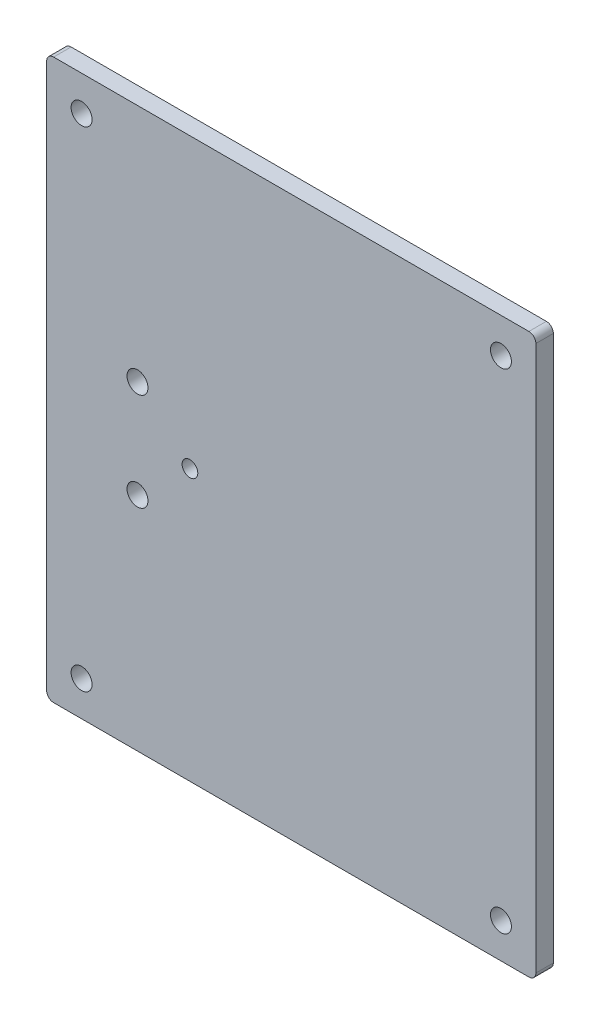
ISO-10303-21;
HEADER;
FILE_DESCRIPTION(('STEP AP214'),'2;1');
FILE_NAME('part.step','',(''),(''),'','','');
FILE_SCHEMA(('AUTOMOTIVE_DESIGN { 1 0 10303 214 1 1 1 1 }'));
ENDSEC;
DATA;
#1=APPLICATION_CONTEXT('core data for automotive mechanical design processes');
#2=APPLICATION_PROTOCOL_DEFINITION('international standard','automotive_design',2000,#1);
#3=PRODUCT_CONTEXT('',#1,'mechanical');
#4=PRODUCT('Part','Part','',(#3));
#5=PRODUCT_RELATED_PRODUCT_CATEGORY('part','',(#4));
#6=PRODUCT_DEFINITION_FORMATION('','',#4);
#7=PRODUCT_DEFINITION_CONTEXT('part definition',#1,'design');
#8=PRODUCT_DEFINITION('design','',#6,#7);
#9=PRODUCT_DEFINITION_SHAPE('','',#8);
#10=(LENGTH_UNIT() NAMED_UNIT(*) SI_UNIT(.MILLI.,.METRE.));
#11=(NAMED_UNIT(*) PLANE_ANGLE_UNIT() SI_UNIT($,.RADIAN.));
#12=(NAMED_UNIT(*) SI_UNIT($,.STERADIAN.) SOLID_ANGLE_UNIT());
#13=UNCERTAINTY_MEASURE_WITH_UNIT(LENGTH_MEASURE(1.E-05),#10,'distance_accuracy_value','');
#14=(GEOMETRIC_REPRESENTATION_CONTEXT(3) GLOBAL_UNCERTAINTY_ASSIGNED_CONTEXT((#13)) GLOBAL_UNIT_ASSIGNED_CONTEXT((#10,
#11,#12)) REPRESENTATION_CONTEXT('',''));
#15=CARTESIAN_POINT('',(0.,0.,0.));
#16=DIRECTION('',(0.,0.,1.));
#17=DIRECTION('',(1.,0.,0.));
#18=AXIS2_PLACEMENT_3D('',#15,#16,#17);
#19=CARTESIAN_POINT('',(0.,0.,5.));
#20=DIRECTION('',(0.,0.,-1.));
#21=DIRECTION('',(-1.,0.,0.));
#22=AXIS2_PLACEMENT_3D('',#19,#20,#21);
#23=PLANE('',#22);
#24=DIRECTION('',(0.,-1.,0.));
#25=VECTOR('',#24,1.);
#26=CARTESIAN_POINT('',(0.,0.,5.));
#27=LINE('',#26,#25);
#28=CARTESIAN_POINT('',(0.,158.,5.));
#29=VERTEX_POINT('',#28);
#30=CARTESIAN_POINT('',(0.,2.,5.));
#31=VERTEX_POINT('',#30);
#32=EDGE_CURVE('E135',#29,#31,#27,.T.);
#33=ORIENTED_EDGE('',*,*,#32,.T.);
#34=CARTESIAN_POINT('',(2.,2.,5.));
#35=DIRECTION('',(0.,0.,-1.));
#36=DIRECTION('',(-1.,0.,0.));
#37=AXIS2_PLACEMENT_3D('',#34,#35,#36);
#38=CIRCLE('',#37,2.);
#39=CARTESIAN_POINT('',(2.,0.,5.));
#40=VERTEX_POINT('',#39);
#41=EDGE_CURVE('E154',#31,#40,#38,.F.);
#42=ORIENTED_EDGE('',*,*,#41,.T.);
#43=DIRECTION('',(1.,0.,0.));
#44=VECTOR('',#43,1.);
#45=CARTESIAN_POINT('',(140.,0.,5.));
#46=LINE('',#45,#44);
#47=CARTESIAN_POINT('',(138.,0.,5.));
#48=VERTEX_POINT('',#47);
#49=EDGE_CURVE('E118',#40,#48,#46,.T.);
#50=ORIENTED_EDGE('',*,*,#49,.T.);
#51=CARTESIAN_POINT('',(138.,2.,5.));
#52=DIRECTION('',(0.,0.,-1.));
#53=DIRECTION('',(-1.,0.,0.));
#54=AXIS2_PLACEMENT_3D('',#51,#52,#53);
#55=CIRCLE('',#54,2.);
#56=CARTESIAN_POINT('',(140.,2.,5.));
#57=VERTEX_POINT('',#56);
#58=EDGE_CURVE('E152',#48,#57,#55,.F.);
#59=ORIENTED_EDGE('',*,*,#58,.T.);
#60=DIRECTION('',(0.,1.,0.));
#61=VECTOR('',#60,1.);
#62=CARTESIAN_POINT('',(140.,160.,5.));
#63=LINE('',#62,#61);
#64=CARTESIAN_POINT('',(140.,158.,5.));
#65=VERTEX_POINT('',#64);
#66=EDGE_CURVE('E174',#57,#65,#63,.T.);
#67=ORIENTED_EDGE('',*,*,#66,.T.);
#68=CARTESIAN_POINT('',(138.,158.,5.));
#69=DIRECTION('',(0.,0.,-1.));
#70=DIRECTION('',(-1.,0.,0.));
#71=AXIS2_PLACEMENT_3D('',#68,#69,#70);
#72=CIRCLE('',#71,2.);
#73=CARTESIAN_POINT('',(138.,160.,5.));
#74=VERTEX_POINT('',#73);
#75=EDGE_CURVE('E53',#65,#74,#72,.F.);
#76=ORIENTED_EDGE('',*,*,#75,.T.);
#77=DIRECTION('',(-1.,0.,0.));
#78=VECTOR('',#77,1.);
#79=CARTESIAN_POINT('',(0.,160.,5.));
#80=LINE('',#79,#78);
#81=CARTESIAN_POINT('',(2.,160.,5.));
#82=VERTEX_POINT('',#81);
#83=EDGE_CURVE('E164',#74,#82,#80,.T.);
#84=ORIENTED_EDGE('',*,*,#83,.T.);
#85=CARTESIAN_POINT('',(2.,158.,5.));
#86=DIRECTION('',(0.,0.,-1.));
#87=DIRECTION('',(-1.,0.,0.));
#88=AXIS2_PLACEMENT_3D('',#85,#86,#87);
#89=CIRCLE('',#88,2.);
#90=EDGE_CURVE('E150',#82,#29,#89,.F.);
#91=ORIENTED_EDGE('',*,*,#90,.T.);
#92=EDGE_LOOP('',(#33,#42,#50,#59,#67,#76,#84,#91));
#93=FACE_BOUND('',#92,.T.);
#94=CARTESIAN_POINT('',(26.,91.5,5.));
#95=DIRECTION('',(0.,0.,1.));
#96=DIRECTION('',(1.,0.,0.));
#97=AXIS2_PLACEMENT_3D('',#94,#95,#96);
#98=CIRCLE('',#97,3.);
#99=CARTESIAN_POINT('',(29.,91.5,5.));
#100=VERTEX_POINT('',#99);
#101=EDGE_CURVE('E126',#100,#100,#98,.T.);
#102=ORIENTED_EDGE('',*,*,#101,.F.);
#103=EDGE_LOOP('',(#102));
#104=FACE_BOUND('',#103,.T.);
#105=CARTESIAN_POINT('',(10.,150.,5.));
#106=DIRECTION('',(0.,0.,1.));
#107=DIRECTION('',(1.,0.,0.));
#108=AXIS2_PLACEMENT_3D('',#105,#106,#107);
#109=CIRCLE('',#108,3.);
#110=CARTESIAN_POINT('',(13.,150.,5.));
#111=VERTEX_POINT('',#110);
#112=EDGE_CURVE('E179',#111,#111,#109,.T.);
#113=ORIENTED_EDGE('',*,*,#112,.F.);
#114=EDGE_LOOP('',(#113));
#115=FACE_BOUND('',#114,.T.);
#116=CARTESIAN_POINT('',(130.,10.,5.));
#117=DIRECTION('',(0.,0.,1.));
#118=DIRECTION('',(1.,0.,0.));
#119=AXIS2_PLACEMENT_3D('',#116,#117,#118);
#120=CIRCLE('',#119,2.99999999999999);
#121=CARTESIAN_POINT('',(133.,10.,5.));
#122=VERTEX_POINT('',#121);
#123=EDGE_CURVE('E184',#122,#122,#120,.T.);
#124=ORIENTED_EDGE('',*,*,#123,.F.);
#125=EDGE_LOOP('',(#124));
#126=FACE_BOUND('',#125,.T.);
#127=CARTESIAN_POINT('',(10.,10.,5.));
#128=DIRECTION('',(0.,0.,1.));
#129=DIRECTION('',(1.,0.,0.));
#130=AXIS2_PLACEMENT_3D('',#127,#128,#129);
#131=CIRCLE('',#130,3.);
#132=CARTESIAN_POINT('',(13.,10.,5.));
#133=VERTEX_POINT('',#132);
#134=EDGE_CURVE('E190',#133,#133,#131,.T.);
#135=ORIENTED_EDGE('',*,*,#134,.F.);
#136=EDGE_LOOP('',(#135));
#137=FACE_BOUND('',#136,.T.);
#138=CARTESIAN_POINT('',(130.,150.,5.));
#139=DIRECTION('',(0.,0.,1.));
#140=DIRECTION('',(1.,0.,0.));
#141=AXIS2_PLACEMENT_3D('',#138,#139,#140);
#142=CIRCLE('',#141,2.99999999999999);
#143=CARTESIAN_POINT('',(133.,150.,5.));
#144=VERTEX_POINT('',#143);
#145=EDGE_CURVE('E196',#144,#144,#142,.T.);
#146=ORIENTED_EDGE('',*,*,#145,.F.);
#147=EDGE_LOOP('',(#146));
#148=FACE_BOUND('',#147,.T.);
#149=CARTESIAN_POINT('',(26.,63.5,5.));
#150=DIRECTION('',(0.,0.,1.));
#151=DIRECTION('',(1.,0.,0.));
#152=AXIS2_PLACEMENT_3D('',#149,#150,#151);
#153=CIRCLE('',#152,3.);
#154=CARTESIAN_POINT('',(29.,63.5,5.));
#155=VERTEX_POINT('',#154);
#156=EDGE_CURVE('E202',#155,#155,#153,.T.);
#157=ORIENTED_EDGE('',*,*,#156,.F.);
#158=EDGE_LOOP('',(#157));
#159=FACE_BOUND('',#158,.T.);
#160=CARTESIAN_POINT('',(41.,77.5,5.));
#161=DIRECTION('',(0.,0.,1.));
#162=DIRECTION('',(1.,0.,0.));
#163=AXIS2_PLACEMENT_3D('',#160,#161,#162);
#164=CIRCLE('',#163,2.24999999999999);
#165=CARTESIAN_POINT('',(43.25,77.5,5.));
#166=VERTEX_POINT('',#165);
#167=EDGE_CURVE('E208',#166,#166,#164,.T.);
#168=ORIENTED_EDGE('',*,*,#167,.F.);
#169=EDGE_LOOP('',(#168));
#170=FACE_BOUND('',#169,.T.);
#171=ADVANCED_FACE('F33',(#93,#104,#115,#126,#137,#148,#159,#170),#23,.F.);
#172=CARTESIAN_POINT('',(0.,0.,0.));
#173=DIRECTION('',(0.,0.,-1.));
#174=DIRECTION('',(-1.,0.,0.));
#175=AXIS2_PLACEMENT_3D('',#172,#173,#174);
#176=PLANE('',#175);
#177=CARTESIAN_POINT('',(26.,63.5,0.));
#178=DIRECTION('',(0.,0.,1.));
#179=DIRECTION('',(1.,0.,0.));
#180=AXIS2_PLACEMENT_3D('',#177,#178,#179);
#181=CIRCLE('',#180,3.);
#182=CARTESIAN_POINT('',(29.,63.5,0.));
#183=VERTEX_POINT('',#182);
#184=EDGE_CURVE('E205',#183,#183,#181,.T.);
#185=ORIENTED_EDGE('',*,*,#184,.T.);
#186=EDGE_LOOP('',(#185));
#187=FACE_BOUND('',#186,.T.);
#188=CARTESIAN_POINT('',(10.,10.,0.));
#189=DIRECTION('',(0.,0.,1.));
#190=DIRECTION('',(1.,0.,0.));
#191=AXIS2_PLACEMENT_3D('',#188,#189,#190);
#192=CIRCLE('',#191,3.);
#193=CARTESIAN_POINT('',(13.,10.,0.));
#194=VERTEX_POINT('',#193);
#195=EDGE_CURVE('E193',#194,#194,#192,.T.);
#196=ORIENTED_EDGE('',*,*,#195,.T.);
#197=EDGE_LOOP('',(#196));
#198=FACE_BOUND('',#197,.T.);
#199=CARTESIAN_POINT('',(10.,150.,0.));
#200=DIRECTION('',(0.,0.,1.));
#201=DIRECTION('',(1.,0.,0.));
#202=AXIS2_PLACEMENT_3D('',#199,#200,#201);
#203=CIRCLE('',#202,3.);
#204=CARTESIAN_POINT('',(13.,150.,0.));
#205=VERTEX_POINT('',#204);
#206=EDGE_CURVE('E181',#205,#205,#203,.T.);
#207=ORIENTED_EDGE('',*,*,#206,.T.);
#208=EDGE_LOOP('',(#207));
#209=FACE_BOUND('',#208,.T.);
#210=DIRECTION('',(1.,0.,0.));
#211=VECTOR('',#210,1.);
#212=CARTESIAN_POINT('',(140.,0.,0.));
#213=LINE('',#212,#211);
#214=CARTESIAN_POINT('',(2.,0.,0.));
#215=VERTEX_POINT('',#214);
#216=CARTESIAN_POINT('',(138.,0.,0.));
#217=VERTEX_POINT('',#216);
#218=EDGE_CURVE('E115',#215,#217,#213,.T.);
#219=ORIENTED_EDGE('',*,*,#218,.F.);
#220=CARTESIAN_POINT('',(2.,2.,0.));
#221=DIRECTION('',(0.,0.,-1.));
#222=DIRECTION('',(-1.,0.,0.));
#223=AXIS2_PLACEMENT_3D('',#220,#221,#222);
#224=CIRCLE('',#223,2.);
#225=CARTESIAN_POINT('',(0.,2.,0.));
#226=VERTEX_POINT('',#225);
#227=EDGE_CURVE('E98',#215,#226,#224,.T.);
#228=ORIENTED_EDGE('',*,*,#227,.T.);
#229=DIRECTION('',(0.,-1.,0.));
#230=VECTOR('',#229,1.);
#231=CARTESIAN_POINT('',(0.,0.,0.));
#232=LINE('',#231,#230);
#233=CARTESIAN_POINT('',(0.,158.,0.));
#234=VERTEX_POINT('',#233);
#235=EDGE_CURVE('E139',#234,#226,#232,.T.);
#236=ORIENTED_EDGE('',*,*,#235,.F.);
#237=CARTESIAN_POINT('',(2.,158.,0.));
#238=DIRECTION('',(0.,0.,-1.));
#239=DIRECTION('',(-1.,0.,0.));
#240=AXIS2_PLACEMENT_3D('',#237,#238,#239);
#241=CIRCLE('',#240,2.);
#242=CARTESIAN_POINT('',(2.,160.,0.));
#243=VERTEX_POINT('',#242);
#244=EDGE_CURVE('E143',#234,#243,#241,.T.);
#245=ORIENTED_EDGE('',*,*,#244,.T.);
#246=DIRECTION('',(-1.,0.,0.));
#247=VECTOR('',#246,1.);
#248=CARTESIAN_POINT('',(0.,160.,0.));
#249=LINE('',#248,#247);
#250=CARTESIAN_POINT('',(138.,160.,0.));
#251=VERTEX_POINT('',#250);
#252=EDGE_CURVE('E129',#251,#243,#249,.T.);
#253=ORIENTED_EDGE('',*,*,#252,.F.);
#254=CARTESIAN_POINT('',(138.,158.,0.));
#255=DIRECTION('',(0.,0.,-1.));
#256=DIRECTION('',(-1.,0.,0.));
#257=AXIS2_PLACEMENT_3D('',#254,#255,#256);
#258=CIRCLE('',#257,2.);
#259=CARTESIAN_POINT('',(140.,158.,0.));
#260=VERTEX_POINT('',#259);
#261=EDGE_CURVE('E119',#251,#260,#258,.T.);
#262=ORIENTED_EDGE('',*,*,#261,.T.);
#263=DIRECTION('',(0.,1.,0.));
#264=VECTOR('',#263,1.);
#265=CARTESIAN_POINT('',(140.,160.,0.));
#266=LINE('',#265,#264);
#267=CARTESIAN_POINT('',(140.,2.,0.));
#268=VERTEX_POINT('',#267);
#269=EDGE_CURVE('E125',#268,#260,#266,.T.);
#270=ORIENTED_EDGE('',*,*,#269,.F.);
#271=CARTESIAN_POINT('',(138.,2.,0.));
#272=DIRECTION('',(0.,0.,-1.));
#273=DIRECTION('',(-1.,0.,0.));
#274=AXIS2_PLACEMENT_3D('',#271,#272,#273);
#275=CIRCLE('',#274,2.);
#276=EDGE_CURVE('E109',#268,#217,#275,.T.);
#277=ORIENTED_EDGE('',*,*,#276,.T.);
#278=EDGE_LOOP('',(#219,#228,#236,#245,#253,#262,#270,#277));
#279=FACE_BOUND('',#278,.T.);
#280=CARTESIAN_POINT('',(26.,91.5,0.));
#281=DIRECTION('',(0.,0.,1.));
#282=DIRECTION('',(1.,0.,0.));
#283=AXIS2_PLACEMENT_3D('',#280,#281,#282);
#284=CIRCLE('',#283,3.);
#285=CARTESIAN_POINT('',(29.,91.5,0.));
#286=VERTEX_POINT('',#285);
#287=EDGE_CURVE('E132',#286,#286,#284,.T.);
#288=ORIENTED_EDGE('',*,*,#287,.T.);
#289=EDGE_LOOP('',(#288));
#290=FACE_BOUND('',#289,.T.);
#291=CARTESIAN_POINT('',(130.,10.,0.));
#292=DIRECTION('',(0.,0.,1.));
#293=DIRECTION('',(1.,0.,0.));
#294=AXIS2_PLACEMENT_3D('',#291,#292,#293);
#295=CIRCLE('',#294,2.99999999999999);
#296=CARTESIAN_POINT('',(133.,10.,0.));
#297=VERTEX_POINT('',#296);
#298=EDGE_CURVE('E187',#297,#297,#295,.T.);
#299=ORIENTED_EDGE('',*,*,#298,.T.);
#300=EDGE_LOOP('',(#299));
#301=FACE_BOUND('',#300,.T.);
#302=CARTESIAN_POINT('',(130.,150.,0.));
#303=DIRECTION('',(0.,0.,1.));
#304=DIRECTION('',(1.,0.,0.));
#305=AXIS2_PLACEMENT_3D('',#302,#303,#304);
#306=CIRCLE('',#305,2.99999999999999);
#307=CARTESIAN_POINT('',(133.,150.,0.));
#308=VERTEX_POINT('',#307);
#309=EDGE_CURVE('E199',#308,#308,#306,.T.);
#310=ORIENTED_EDGE('',*,*,#309,.T.);
#311=EDGE_LOOP('',(#310));
#312=FACE_BOUND('',#311,.T.);
#313=CARTESIAN_POINT('',(41.,77.5,0.));
#314=DIRECTION('',(0.,0.,1.));
#315=DIRECTION('',(1.,0.,0.));
#316=AXIS2_PLACEMENT_3D('',#313,#314,#315);
#317=CIRCLE('',#316,2.24999999999999);
#318=CARTESIAN_POINT('',(43.25,77.5,0.));
#319=VERTEX_POINT('',#318);
#320=EDGE_CURVE('E211',#319,#319,#317,.T.);
#321=ORIENTED_EDGE('',*,*,#320,.T.);
#322=EDGE_LOOP('',(#321));
#323=FACE_BOUND('',#322,.T.);
#324=ADVANCED_FACE('F122',(#187,#198,#209,#279,#290,#301,#312,#323),#176,.T.);
#325=CARTESIAN_POINT('',(140.,0.,5.));
#326=DIRECTION('',(0.,1.,0.));
#327=DIRECTION('',(-1.,0.,0.));
#328=AXIS2_PLACEMENT_3D('',#325,#326,#327);
#329=PLANE('',#328);
#330=ORIENTED_EDGE('',*,*,#49,.F.);
#331=DIRECTION('',(0.,0.,-1.));
#332=VECTOR('',#331,1.);
#333=CARTESIAN_POINT('',(2.,0.,5.));
#334=LINE('',#333,#332);
#335=EDGE_CURVE('E102',#40,#215,#334,.T.);
#336=ORIENTED_EDGE('',*,*,#335,.T.);
#337=ORIENTED_EDGE('',*,*,#218,.T.);
#338=DIRECTION('',(0.,0.,-1.));
#339=VECTOR('',#338,1.);
#340=CARTESIAN_POINT('',(138.,0.,5.));
#341=LINE('',#340,#339);
#342=EDGE_CURVE('E120',#217,#48,#341,.F.);
#343=ORIENTED_EDGE('',*,*,#342,.T.);
#344=EDGE_LOOP('',(#330,#336,#337,#343));
#345=FACE_BOUND('',#344,.T.);
#346=ADVANCED_FACE('F114',(#345),#329,.F.);
#347=CARTESIAN_POINT('',(140.,160.,5.));
#348=DIRECTION('',(-1.,0.,0.));
#349=DIRECTION('',(0.,-1.,0.));
#350=AXIS2_PLACEMENT_3D('',#347,#348,#349);
#351=PLANE('',#350);
#352=ORIENTED_EDGE('',*,*,#66,.F.);
#353=DIRECTION('',(0.,0.,-1.));
#354=VECTOR('',#353,1.);
#355=CARTESIAN_POINT('',(140.,2.,5.));
#356=LINE('',#355,#354);
#357=EDGE_CURVE('E158',#57,#268,#356,.T.);
#358=ORIENTED_EDGE('',*,*,#357,.T.);
#359=ORIENTED_EDGE('',*,*,#269,.T.);
#360=DIRECTION('',(0.,0.,-1.));
#361=VECTOR('',#360,1.);
#362=CARTESIAN_POINT('',(140.,158.,5.));
#363=LINE('',#362,#361);
#364=EDGE_CURVE('E156',#260,#65,#363,.F.);
#365=ORIENTED_EDGE('',*,*,#364,.T.);
#366=EDGE_LOOP('',(#352,#358,#359,#365));
#367=FACE_BOUND('',#366,.T.);
#368=ADVANCED_FACE('F236',(#367),#351,.F.);
#369=CARTESIAN_POINT('',(0.,160.,5.));
#370=DIRECTION('',(0.,-1.,0.));
#371=DIRECTION('',(0.,0.,-1.));
#372=AXIS2_PLACEMENT_3D('',#369,#370,#371);
#373=PLANE('',#372);
#374=ORIENTED_EDGE('',*,*,#252,.T.);
#375=DIRECTION('',(0.,0.,-1.));
#376=VECTOR('',#375,1.);
#377=CARTESIAN_POINT('',(2.,160.,5.));
#378=LINE('',#377,#376);
#379=EDGE_CURVE('E11',#243,#82,#378,.F.);
#380=ORIENTED_EDGE('',*,*,#379,.T.);
#381=ORIENTED_EDGE('',*,*,#83,.F.);
#382=DIRECTION('',(0.,0.,-1.));
#383=VECTOR('',#382,1.);
#384=CARTESIAN_POINT('',(138.,160.,5.));
#385=LINE('',#384,#383);
#386=EDGE_CURVE('E41',#74,#251,#385,.T.);
#387=ORIENTED_EDGE('',*,*,#386,.T.);
#388=EDGE_LOOP('',(#374,#380,#381,#387));
#389=FACE_BOUND('',#388,.T.);
#390=ADVANCED_FACE('F163',(#389),#373,.F.);
#391=CARTESIAN_POINT('',(0.,0.,5.));
#392=DIRECTION('',(1.,0.,0.));
#393=DIRECTION('',(0.,0.,-1.));
#394=AXIS2_PLACEMENT_3D('',#391,#392,#393);
#395=PLANE('',#394);
#396=ORIENTED_EDGE('',*,*,#235,.T.);
#397=DIRECTION('',(0.,0.,-1.));
#398=VECTOR('',#397,1.);
#399=CARTESIAN_POINT('',(0.,2.,5.));
#400=LINE('',#399,#398);
#401=EDGE_CURVE('E103',#226,#31,#400,.F.);
#402=ORIENTED_EDGE('',*,*,#401,.T.);
#403=ORIENTED_EDGE('',*,*,#32,.F.);
#404=DIRECTION('',(0.,0.,-1.));
#405=VECTOR('',#404,1.);
#406=CARTESIAN_POINT('',(0.,158.,5.));
#407=LINE('',#406,#405);
#408=EDGE_CURVE('E108',#29,#234,#407,.T.);
#409=ORIENTED_EDGE('',*,*,#408,.T.);
#410=EDGE_LOOP('',(#396,#402,#403,#409));
#411=FACE_BOUND('',#410,.T.);
#412=ADVANCED_FACE('F172',(#411),#395,.F.);
#413=CARTESIAN_POINT('',(26.,91.5,5.));
#414=DIRECTION('',(0.,0.,-1.));
#415=DIRECTION('',(-1.,0.,0.));
#416=AXIS2_PLACEMENT_3D('',#413,#414,#415);
#417=CYLINDRICAL_SURFACE('',#416,3.);
#418=ORIENTED_EDGE('',*,*,#101,.T.);
#419=EDGE_LOOP('',(#418));
#420=FACE_BOUND('',#419,.T.);
#421=ORIENTED_EDGE('',*,*,#287,.F.);
#422=EDGE_LOOP('',(#421));
#423=FACE_BOUND('',#422,.T.);
#424=ADVANCED_FACE('F229',(#420,#423),#417,.F.);
#425=CARTESIAN_POINT('',(10.,150.,5.));
#426=DIRECTION('',(0.,0.,-1.));
#427=DIRECTION('',(-1.,0.,0.));
#428=AXIS2_PLACEMENT_3D('',#425,#426,#427);
#429=CYLINDRICAL_SURFACE('',#428,3.);
#430=ORIENTED_EDGE('',*,*,#112,.T.);
#431=EDGE_LOOP('',(#430));
#432=FACE_BOUND('',#431,.T.);
#433=ORIENTED_EDGE('',*,*,#206,.F.);
#434=EDGE_LOOP('',(#433));
#435=FACE_BOUND('',#434,.T.);
#436=ADVANCED_FACE('F357',(#432,#435),#429,.F.);
#437=CARTESIAN_POINT('',(130.,10.,5.));
#438=DIRECTION('',(0.,0.,-1.));
#439=DIRECTION('',(-1.,0.,0.));
#440=AXIS2_PLACEMENT_3D('',#437,#438,#439);
#441=CYLINDRICAL_SURFACE('',#440,2.99999999999999);
#442=ORIENTED_EDGE('',*,*,#123,.T.);
#443=EDGE_LOOP('',(#442));
#444=FACE_BOUND('',#443,.T.);
#445=ORIENTED_EDGE('',*,*,#298,.F.);
#446=EDGE_LOOP('',(#445));
#447=FACE_BOUND('',#446,.T.);
#448=ADVANCED_FACE('F347',(#444,#447),#441,.F.);
#449=CARTESIAN_POINT('',(10.,10.,5.));
#450=DIRECTION('',(0.,0.,-1.));
#451=DIRECTION('',(-1.,0.,0.));
#452=AXIS2_PLACEMENT_3D('',#449,#450,#451);
#453=CYLINDRICAL_SURFACE('',#452,3.);
#454=ORIENTED_EDGE('',*,*,#134,.T.);
#455=EDGE_LOOP('',(#454));
#456=FACE_BOUND('',#455,.T.);
#457=ORIENTED_EDGE('',*,*,#195,.F.);
#458=EDGE_LOOP('',(#457));
#459=FACE_BOUND('',#458,.T.);
#460=ADVANCED_FACE('F337',(#456,#459),#453,.F.);
#461=CARTESIAN_POINT('',(130.,150.,5.));
#462=DIRECTION('',(0.,0.,-1.));
#463=DIRECTION('',(-1.,0.,0.));
#464=AXIS2_PLACEMENT_3D('',#461,#462,#463);
#465=CYLINDRICAL_SURFACE('',#464,2.99999999999999);
#466=ORIENTED_EDGE('',*,*,#145,.T.);
#467=EDGE_LOOP('',(#466));
#468=FACE_BOUND('',#467,.T.);
#469=ORIENTED_EDGE('',*,*,#309,.F.);
#470=EDGE_LOOP('',(#469));
#471=FACE_BOUND('',#470,.T.);
#472=ADVANCED_FACE('F327',(#468,#471),#465,.F.);
#473=CARTESIAN_POINT('',(26.,63.5,5.));
#474=DIRECTION('',(0.,0.,-1.));
#475=DIRECTION('',(-1.,0.,0.));
#476=AXIS2_PLACEMENT_3D('',#473,#474,#475);
#477=CYLINDRICAL_SURFACE('',#476,3.);
#478=ORIENTED_EDGE('',*,*,#156,.T.);
#479=EDGE_LOOP('',(#478));
#480=FACE_BOUND('',#479,.T.);
#481=ORIENTED_EDGE('',*,*,#184,.F.);
#482=EDGE_LOOP('',(#481));
#483=FACE_BOUND('',#482,.T.);
#484=ADVANCED_FACE('F318',(#480,#483),#477,.F.);
#485=CARTESIAN_POINT('',(41.,77.5,5.));
#486=DIRECTION('',(0.,0.,-1.));
#487=DIRECTION('',(-1.,0.,0.));
#488=AXIS2_PLACEMENT_3D('',#485,#486,#487);
#489=CYLINDRICAL_SURFACE('',#488,2.24999999999999);
#490=ORIENTED_EDGE('',*,*,#167,.T.);
#491=EDGE_LOOP('',(#490));
#492=FACE_BOUND('',#491,.T.);
#493=ORIENTED_EDGE('',*,*,#320,.F.);
#494=EDGE_LOOP('',(#493));
#495=FACE_BOUND('',#494,.T.);
#496=ADVANCED_FACE('F217',(#492,#495),#489,.F.);
#497=CARTESIAN_POINT('',(2.,2.,5.));
#498=DIRECTION('',(0.,0.,-1.));
#499=DIRECTION('',(-1.,0.,0.));
#500=AXIS2_PLACEMENT_3D('',#497,#498,#499);
#501=CYLINDRICAL_SURFACE('',#500,2.);
#502=ORIENTED_EDGE('',*,*,#41,.F.);
#503=ORIENTED_EDGE('',*,*,#401,.F.);
#504=ORIENTED_EDGE('',*,*,#227,.F.);
#505=ORIENTED_EDGE('',*,*,#335,.F.);
#506=EDGE_LOOP('',(#502,#503,#504,#505));
#507=FACE_BOUND('',#506,.T.);
#508=ADVANCED_FACE('F101',(#507),#501,.T.);
#509=CARTESIAN_POINT('',(138.,2.,5.));
#510=DIRECTION('',(0.,0.,-1.));
#511=DIRECTION('',(-1.,0.,0.));
#512=AXIS2_PLACEMENT_3D('',#509,#510,#511);
#513=CYLINDRICAL_SURFACE('',#512,2.);
#514=ORIENTED_EDGE('',*,*,#58,.F.);
#515=ORIENTED_EDGE('',*,*,#342,.F.);
#516=ORIENTED_EDGE('',*,*,#276,.F.);
#517=ORIENTED_EDGE('',*,*,#357,.F.);
#518=EDGE_LOOP('',(#514,#515,#516,#517));
#519=FACE_BOUND('',#518,.T.);
#520=ADVANCED_FACE('F244',(#519),#513,.T.);
#521=CARTESIAN_POINT('',(2.,158.,5.));
#522=DIRECTION('',(0.,0.,-1.));
#523=DIRECTION('',(-1.,0.,0.));
#524=AXIS2_PLACEMENT_3D('',#521,#522,#523);
#525=CYLINDRICAL_SURFACE('',#524,2.);
#526=ORIENTED_EDGE('',*,*,#90,.F.);
#527=ORIENTED_EDGE('',*,*,#379,.F.);
#528=ORIENTED_EDGE('',*,*,#244,.F.);
#529=ORIENTED_EDGE('',*,*,#408,.F.);
#530=EDGE_LOOP('',(#526,#527,#528,#529));
#531=FACE_BOUND('',#530,.T.);
#532=ADVANCED_FACE('F169',(#531),#525,.T.);
#533=CARTESIAN_POINT('',(138.,158.,5.));
#534=DIRECTION('',(0.,0.,-1.));
#535=DIRECTION('',(-1.,0.,0.));
#536=AXIS2_PLACEMENT_3D('',#533,#534,#535);
#537=CYLINDRICAL_SURFACE('',#536,2.);
#538=ORIENTED_EDGE('',*,*,#75,.F.);
#539=ORIENTED_EDGE('',*,*,#364,.F.);
#540=ORIENTED_EDGE('',*,*,#261,.F.);
#541=ORIENTED_EDGE('',*,*,#386,.F.);
#542=EDGE_LOOP('',(#538,#539,#540,#541));
#543=FACE_BOUND('',#542,.T.);
#544=ADVANCED_FACE('F35',(#543),#537,.T.);
#545=CLOSED_SHELL('',(#171,#324,#346,#368,#390,#412,#424,#436,#448,#460,#472,#484,#496,#508,
#520,#532,#544));
#546=MANIFOLD_SOLID_BREP('B2',#545);
#547=ADVANCED_BREP_SHAPE_REPRESENTATION('',(#18,#546),#14);
#548=SHAPE_DEFINITION_REPRESENTATION(#9,#547);
ENDSEC;
END-ISO-10303-21;
